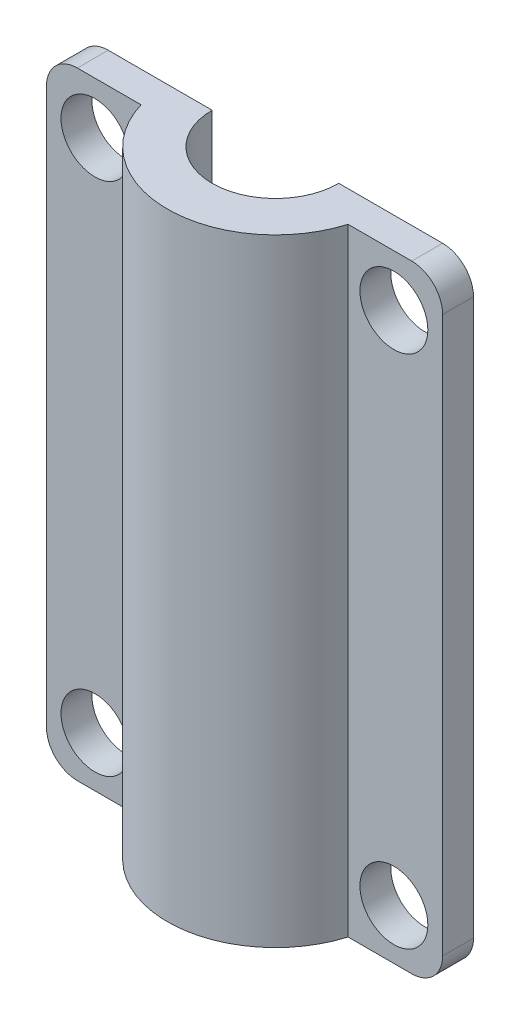
ISO-10303-21;
HEADER;
FILE_DESCRIPTION(('STEP AP214'),'2;1');
FILE_NAME('part.step','',(''),(''),'','','');
FILE_SCHEMA(('AUTOMOTIVE_DESIGN { 1 0 10303 214 1 1 1 1 }'));
ENDSEC;
DATA;
#1=APPLICATION_CONTEXT('core data for automotive mechanical design processes');
#2=APPLICATION_PROTOCOL_DEFINITION('international standard','automotive_design',2000,#1);
#3=PRODUCT_CONTEXT('',#1,'mechanical');
#4=PRODUCT('Part','Part','',(#3));
#5=PRODUCT_RELATED_PRODUCT_CATEGORY('part','',(#4));
#6=PRODUCT_DEFINITION_FORMATION('','',#4);
#7=PRODUCT_DEFINITION_CONTEXT('part definition',#1,'design');
#8=PRODUCT_DEFINITION('design','',#6,#7);
#9=PRODUCT_DEFINITION_SHAPE('','',#8);
#10=(LENGTH_UNIT() NAMED_UNIT(*) SI_UNIT(.MILLI.,.METRE.));
#11=(NAMED_UNIT(*) PLANE_ANGLE_UNIT() SI_UNIT($,.RADIAN.));
#12=(NAMED_UNIT(*) SI_UNIT($,.STERADIAN.) SOLID_ANGLE_UNIT());
#13=UNCERTAINTY_MEASURE_WITH_UNIT(LENGTH_MEASURE(1.E-05),#10,'distance_accuracy_value','');
#14=(GEOMETRIC_REPRESENTATION_CONTEXT(3) GLOBAL_UNCERTAINTY_ASSIGNED_CONTEXT((#13)) GLOBAL_UNIT_ASSIGNED_CONTEXT((#10,
#11,#12)) REPRESENTATION_CONTEXT('',''));
#15=CARTESIAN_POINT('',(0.,0.,0.));
#16=DIRECTION('',(0.,0.,1.));
#17=DIRECTION('',(1.,0.,0.));
#18=AXIS2_PLACEMENT_3D('',#15,#16,#17);
#19=CARTESIAN_POINT('',(67.3512185674811,20.,15.2871800490329));
#20=DIRECTION('',(0.,0.,-1.));
#21=DIRECTION('',(-1.,0.,0.));
#22=AXIS2_PLACEMENT_3D('',#19,#20,#21);
#23=PLANE('',#22);
#24=CARTESIAN_POINT('',(68.9210191731618,1.62968956518976,15.2871800490329));
#25=DIRECTION('',(0.,0.,-1.));
#26=DIRECTION('',(-1.,0.,0.));
#27=AXIS2_PLACEMENT_3D('',#24,#25,#26);
#28=CIRCLE('',#27,1.10000000000001);
#29=CARTESIAN_POINT('',(67.8210191731618,1.62968956518976,15.2871800490329));
#30=VERTEX_POINT('',#29);
#31=EDGE_CURVE('E245',#30,#30,#28,.T.);
#32=ORIENTED_EDGE('',*,*,#31,.T.);
#33=EDGE_LOOP('',(#32));
#34=FACE_BOUND('',#33,.T.);
#35=CARTESIAN_POINT('',(68.9210191731618,18.3272957416921,15.2871800490329));
#36=DIRECTION('',(0.,0.,-1.));
#37=DIRECTION('',(-1.,0.,0.));
#38=AXIS2_PLACEMENT_3D('',#35,#36,#37);
#39=CIRCLE('',#38,1.10000000000001);
#40=CARTESIAN_POINT('',(67.8210191731618,18.3272957416921,15.2871800490329));
#41=VERTEX_POINT('',#40);
#42=EDGE_CURVE('E248',#41,#41,#39,.T.);
#43=ORIENTED_EDGE('',*,*,#42,.T.);
#44=EDGE_LOOP('',(#43));
#45=FACE_BOUND('',#44,.T.);
#46=DIRECTION('',(1.,0.,0.));
#47=VECTOR('',#46,1.);
#48=CARTESIAN_POINT('',(67.3512185674811,20.,15.2871800490329));
#49=LINE('',#48,#47);
#50=CARTESIAN_POINT('',(68.3512185674811,20.,15.2871800490329));
#51=VERTEX_POINT('',#50);
#52=CARTESIAN_POINT('',(70.4146991460521,20.,15.2871800490329));
#53=VERTEX_POINT('',#52);
#54=EDGE_CURVE('E122',#51,#53,#49,.T.);
#55=ORIENTED_EDGE('',*,*,#54,.F.);
#56=CARTESIAN_POINT('',(68.3512185674811,19.,15.2871800490329));
#57=DIRECTION('',(0.,0.,-1.));
#58=DIRECTION('',(-1.,0.,0.));
#59=AXIS2_PLACEMENT_3D('',#56,#57,#58);
#60=CIRCLE('',#59,1.);
#61=CARTESIAN_POINT('',(67.3512185674811,19.,15.2871800490329));
#62=VERTEX_POINT('',#61);
#63=EDGE_CURVE('E175',#51,#62,#60,.F.);
#64=ORIENTED_EDGE('',*,*,#63,.T.);
#65=DIRECTION('',(0.,-1.,0.));
#66=VECTOR('',#65,1.);
#67=CARTESIAN_POINT('',(67.3512185674811,20.,15.2871800490329));
#68=LINE('',#67,#66);
#69=CARTESIAN_POINT('',(67.3512185674811,1.,15.2871800490329));
#70=VERTEX_POINT('',#69);
#71=EDGE_CURVE('E183',#62,#70,#68,.T.);
#72=ORIENTED_EDGE('',*,*,#71,.T.);
#73=CARTESIAN_POINT('',(68.3512185674811,1.,15.2871800490329));
#74=DIRECTION('',(0.,0.,-1.));
#75=DIRECTION('',(-1.,0.,0.));
#76=AXIS2_PLACEMENT_3D('',#73,#74,#75);
#77=CIRCLE('',#76,1.);
#78=CARTESIAN_POINT('',(68.3512185674811,0.,15.2871800490329));
#79=VERTEX_POINT('',#78);
#80=EDGE_CURVE('E173',#70,#79,#77,.F.);
#81=ORIENTED_EDGE('',*,*,#80,.T.);
#82=DIRECTION('',(1.,0.,0.));
#83=VECTOR('',#82,1.);
#84=CARTESIAN_POINT('',(67.3512185674811,0.,15.2871800490329));
#85=LINE('',#84,#83);
#86=CARTESIAN_POINT('',(70.4146991460521,0.,15.2871800490329));
#87=VERTEX_POINT('',#86);
#88=EDGE_CURVE('E145',#79,#87,#85,.T.);
#89=ORIENTED_EDGE('',*,*,#88,.T.);
#90=DIRECTION('',(0.,-1.,0.));
#91=VECTOR('',#90,1.);
#92=CARTESIAN_POINT('',(70.4146991460521,20.,15.2871800490329));
#93=LINE('',#92,#91);
#94=EDGE_CURVE('E138',#53,#87,#93,.T.);
#95=ORIENTED_EDGE('',*,*,#94,.F.);
#96=EDGE_LOOP('',(#55,#64,#72,#81,#89,#95));
#97=FACE_BOUND('',#96,.T.);
#98=ADVANCED_FACE('F33',(#34,#45,#97),#23,.F.);
#99=CARTESIAN_POINT('',(73.7688011123018,20.,14.2871800490328));
#100=DIRECTION('',(0.,-1.,0.));
#101=DIRECTION('',(0.,0.,-1.));
#102=AXIS2_PLACEMENT_3D('',#99,#100,#101);
#103=CYLINDRICAL_SURFACE('',#102,3.50000000000001);
#104=CARTESIAN_POINT('',(73.7688011123018,0.,14.2871800490328));
#105=DIRECTION('',(0.,1.,0.));
#106=DIRECTION('',(0.,0.,1.));
#107=AXIS2_PLACEMENT_3D('',#104,#105,#106);
#108=CIRCLE('',#107,3.50000000000001);
#109=CARTESIAN_POINT('',(77.1229030785515,0.,15.2871800490329));
#110=VERTEX_POINT('',#109);
#111=EDGE_CURVE('E230',#87,#110,#108,.T.);
#112=ORIENTED_EDGE('',*,*,#111,.T.);
#113=DIRECTION('',(0.,-1.,0.));
#114=VECTOR('',#113,1.);
#115=CARTESIAN_POINT('',(77.1229030785515,20.,15.2871800490329));
#116=LINE('',#115,#114);
#117=CARTESIAN_POINT('',(77.1229030785515,20.,15.2871800490329));
#118=VERTEX_POINT('',#117);
#119=EDGE_CURVE('E140',#118,#110,#116,.T.);
#120=ORIENTED_EDGE('',*,*,#119,.F.);
#121=CARTESIAN_POINT('',(73.7688011123018,20.,14.2871800490328));
#122=DIRECTION('',(0.,1.,0.));
#123=DIRECTION('',(0.,0.,1.));
#124=AXIS2_PLACEMENT_3D('',#121,#122,#123);
#125=CIRCLE('',#124,3.50000000000001);
#126=EDGE_CURVE('E126',#53,#118,#125,.T.);
#127=ORIENTED_EDGE('',*,*,#126,.F.);
#128=ORIENTED_EDGE('',*,*,#94,.T.);
#129=EDGE_LOOP('',(#112,#120,#127,#128));
#130=FACE_BOUND('',#129,.T.);
#131=ADVANCED_FACE('F137',(#130),#103,.T.);
#132=CARTESIAN_POINT('',(77.1229030785515,20.,15.2871800490329));
#133=DIRECTION('',(0.,0.,-1.));
#134=DIRECTION('',(-1.,0.,0.));
#135=AXIS2_PLACEMENT_3D('',#132,#133,#134);
#136=PLANE('',#135);
#137=CARTESIAN_POINT('',(78.6065542598319,18.3272957416921,15.2871800490329));
#138=DIRECTION('',(0.,0.,-1.));
#139=DIRECTION('',(-1.,0.,0.));
#140=AXIS2_PLACEMENT_3D('',#137,#138,#139);
#141=CIRCLE('',#140,1.10000000000001);
#142=CARTESIAN_POINT('',(77.5065542598319,18.3272957416921,15.2871800490329));
#143=VERTEX_POINT('',#142);
#144=EDGE_CURVE('E234',#143,#143,#141,.T.);
#145=ORIENTED_EDGE('',*,*,#144,.T.);
#146=EDGE_LOOP('',(#145));
#147=FACE_BOUND('',#146,.T.);
#148=CARTESIAN_POINT('',(78.6065542598319,1.62968956518976,15.2871800490329));
#149=DIRECTION('',(0.,0.,-1.));
#150=DIRECTION('',(-1.,0.,0.));
#151=AXIS2_PLACEMENT_3D('',#148,#149,#150);
#152=CIRCLE('',#151,1.10000000000001);
#153=CARTESIAN_POINT('',(77.5065542598319,1.62968956518976,15.2871800490329));
#154=VERTEX_POINT('',#153);
#155=EDGE_CURVE('E242',#154,#154,#152,.T.);
#156=ORIENTED_EDGE('',*,*,#155,.T.);
#157=EDGE_LOOP('',(#156));
#158=FACE_BOUND('',#157,.T.);
#159=DIRECTION('',(0.,-1.,0.));
#160=VECTOR('',#159,1.);
#161=CARTESIAN_POINT('',(80.1863836571224,20.,15.2871800490329));
#162=LINE('',#161,#160);
#163=CARTESIAN_POINT('',(80.1863836571224,19.,15.2871800490329));
#164=VERTEX_POINT('',#163);
#165=CARTESIAN_POINT('',(80.1863836571224,1.,15.2871800490329));
#166=VERTEX_POINT('',#165);
#167=EDGE_CURVE('E150',#164,#166,#162,.T.);
#168=ORIENTED_EDGE('',*,*,#167,.F.);
#169=CARTESIAN_POINT('',(79.1863836571224,19.,15.2871800490329));
#170=DIRECTION('',(0.,0.,-1.));
#171=DIRECTION('',(-1.,0.,0.));
#172=AXIS2_PLACEMENT_3D('',#169,#170,#171);
#173=CIRCLE('',#172,1.);
#174=CARTESIAN_POINT('',(79.1863836571224,20.,15.2871800490329));
#175=VERTEX_POINT('',#174);
#176=EDGE_CURVE('E167',#164,#175,#173,.F.);
#177=ORIENTED_EDGE('',*,*,#176,.T.);
#178=DIRECTION('',(1.,0.,0.));
#179=VECTOR('',#178,1.);
#180=CARTESIAN_POINT('',(77.1229030785515,20.,15.2871800490329));
#181=LINE('',#180,#179);
#182=EDGE_CURVE('E142',#118,#175,#181,.T.);
#183=ORIENTED_EDGE('',*,*,#182,.F.);
#184=ORIENTED_EDGE('',*,*,#119,.T.);
#185=DIRECTION('',(1.,0.,0.));
#186=VECTOR('',#185,1.);
#187=CARTESIAN_POINT('',(77.1229030785515,0.,15.2871800490329));
#188=LINE('',#187,#186);
#189=CARTESIAN_POINT('',(79.1863836571224,0.,15.2871800490329));
#190=VERTEX_POINT('',#189);
#191=EDGE_CURVE('E228',#110,#190,#188,.T.);
#192=ORIENTED_EDGE('',*,*,#191,.T.);
#193=CARTESIAN_POINT('',(79.1863836571224,1.,15.2871800490329));
#194=DIRECTION('',(0.,0.,-1.));
#195=DIRECTION('',(-1.,0.,0.));
#196=AXIS2_PLACEMENT_3D('',#193,#194,#195);
#197=CIRCLE('',#196,1.);
#198=EDGE_CURVE('E165',#190,#166,#197,.F.);
#199=ORIENTED_EDGE('',*,*,#198,.T.);
#200=EDGE_LOOP('',(#168,#177,#183,#184,#192,#199));
#201=FACE_BOUND('',#200,.T.);
#202=ADVANCED_FACE('F273',(#147,#158,#201),#136,.F.);
#203=CARTESIAN_POINT('',(80.1863836571224,20.,15.2871800490329));
#204=DIRECTION('',(-1.,0.,0.));
#205=DIRECTION('',(0.,0.,1.));
#206=AXIS2_PLACEMENT_3D('',#203,#204,#205);
#207=PLANE('',#206);
#208=DIRECTION('',(0.,-1.,0.));
#209=VECTOR('',#208,1.);
#210=CARTESIAN_POINT('',(80.1863836571224,20.,14.2871800490328));
#211=LINE('',#210,#209);
#212=CARTESIAN_POINT('',(80.1863836571224,19.,14.2871800490328));
#213=VERTEX_POINT('',#212);
#214=CARTESIAN_POINT('',(80.1863836571224,1.,14.2871800490328));
#215=VERTEX_POINT('',#214);
#216=EDGE_CURVE('E200',#213,#215,#211,.T.);
#217=ORIENTED_EDGE('',*,*,#216,.F.);
#218=DIRECTION('',(0.,0.,-1.));
#219=VECTOR('',#218,1.);
#220=CARTESIAN_POINT('',(80.1863836571224,19.,15.2871800490329));
#221=LINE('',#220,#219);
#222=EDGE_CURVE('E163',#213,#164,#221,.F.);
#223=ORIENTED_EDGE('',*,*,#222,.T.);
#224=ORIENTED_EDGE('',*,*,#167,.T.);
#225=DIRECTION('',(0.,0.,-1.));
#226=VECTOR('',#225,1.);
#227=CARTESIAN_POINT('',(80.1863836571224,1.,15.2871800490329));
#228=LINE('',#227,#226);
#229=EDGE_CURVE('E160',#166,#215,#228,.T.);
#230=ORIENTED_EDGE('',*,*,#229,.T.);
#231=EDGE_LOOP('',(#217,#223,#224,#230));
#232=FACE_BOUND('',#231,.T.);
#233=ADVANCED_FACE('F207',(#232),#207,.F.);
#234=CARTESIAN_POINT('',(80.1863836571224,20.,14.2871800490328));
#235=DIRECTION('',(0.,0.,1.));
#236=DIRECTION('',(1.,0.,0.));
#237=AXIS2_PLACEMENT_3D('',#234,#235,#236);
#238=PLANE('',#237);
#239=CARTESIAN_POINT('',(78.6065542598319,18.3272957416921,14.2871800490328));
#240=DIRECTION('',(0.,0.,1.));
#241=DIRECTION('',(1.,0.,0.));
#242=AXIS2_PLACEMENT_3D('',#239,#240,#241);
#243=CIRCLE('',#242,1.10000000000001);
#244=CARTESIAN_POINT('',(79.7065542598319,18.3272957416921,14.2871800490328));
#245=VERTEX_POINT('',#244);
#246=EDGE_CURVE('E255',#245,#245,#243,.T.);
#247=ORIENTED_EDGE('',*,*,#246,.T.);
#248=EDGE_LOOP('',(#247));
#249=FACE_BOUND('',#248,.T.);
#250=CARTESIAN_POINT('',(78.6065542598319,1.62968956518976,14.2871800490328));
#251=DIRECTION('',(0.,0.,1.));
#252=DIRECTION('',(1.,0.,0.));
#253=AXIS2_PLACEMENT_3D('',#250,#251,#252);
#254=CIRCLE('',#253,1.10000000000001);
#255=CARTESIAN_POINT('',(79.7065542598319,1.62968956518976,14.2871800490328));
#256=VERTEX_POINT('',#255);
#257=EDGE_CURVE('E258',#256,#256,#254,.T.);
#258=ORIENTED_EDGE('',*,*,#257,.T.);
#259=EDGE_LOOP('',(#258));
#260=FACE_BOUND('',#259,.T.);
#261=DIRECTION('',(-1.,0.,0.));
#262=VECTOR('',#261,1.);
#263=CARTESIAN_POINT('',(80.1863836571224,20.,14.2871800490328));
#264=LINE('',#263,#262);
#265=CARTESIAN_POINT('',(79.1863836571224,20.,14.2871800490328));
#266=VERTEX_POINT('',#265);
#267=CARTESIAN_POINT('',(75.8238850180164,20.,14.2871800490328));
#268=VERTEX_POINT('',#267);
#269=EDGE_CURVE('E237',#266,#268,#264,.T.);
#270=ORIENTED_EDGE('',*,*,#269,.F.);
#271=CARTESIAN_POINT('',(79.1863836571224,19.,14.2871800490328));
#272=DIRECTION('',(0.,0.,1.));
#273=DIRECTION('',(1.,0.,0.));
#274=AXIS2_PLACEMENT_3D('',#271,#272,#273);
#275=CIRCLE('',#274,1.);
#276=EDGE_CURVE('E158',#266,#213,#275,.F.);
#277=ORIENTED_EDGE('',*,*,#276,.T.);
#278=ORIENTED_EDGE('',*,*,#216,.T.);
#279=CARTESIAN_POINT('',(79.1863836571224,1.,14.2871800490328));
#280=DIRECTION('',(0.,0.,1.));
#281=DIRECTION('',(1.,0.,0.));
#282=AXIS2_PLACEMENT_3D('',#279,#280,#281);
#283=CIRCLE('',#282,1.);
#284=CARTESIAN_POINT('',(79.1863836571224,0.,14.2871800490328));
#285=VERTEX_POINT('',#284);
#286=EDGE_CURVE('E156',#215,#285,#283,.F.);
#287=ORIENTED_EDGE('',*,*,#286,.T.);
#288=DIRECTION('',(-1.,0.,0.));
#289=VECTOR('',#288,1.);
#290=CARTESIAN_POINT('',(80.1863836571224,0.,14.2871800490328));
#291=LINE('',#290,#289);
#292=CARTESIAN_POINT('',(75.8238850180164,0.,14.2871800490328));
#293=VERTEX_POINT('',#292);
#294=EDGE_CURVE('E220',#285,#293,#291,.T.);
#295=ORIENTED_EDGE('',*,*,#294,.T.);
#296=DIRECTION('',(0.,-1.,0.));
#297=VECTOR('',#296,1.);
#298=CARTESIAN_POINT('',(75.8238850180164,20.,14.2871800490328));
#299=LINE('',#298,#297);
#300=EDGE_CURVE('E197',#268,#293,#299,.T.);
#301=ORIENTED_EDGE('',*,*,#300,.F.);
#302=EDGE_LOOP('',(#270,#277,#278,#287,#295,#301));
#303=FACE_BOUND('',#302,.T.);
#304=ADVANCED_FACE('F218',(#249,#260,#303),#238,.F.);
#305=CARTESIAN_POINT('',(73.7713430651591,20.,14.2871800490329));
#306=DIRECTION('',(0.,-1.,0.));
#307=DIRECTION('',(0.,0.,-1.));
#308=AXIS2_PLACEMENT_3D('',#305,#306,#307);
#309=CYLINDRICAL_SURFACE('',#308,2.05254195285727);
#310=CARTESIAN_POINT('',(73.7713430651591,0.,14.2871800490329));
#311=DIRECTION('',(0.,-1.,0.));
#312=DIRECTION('',(0.,0.,1.));
#313=AXIS2_PLACEMENT_3D('',#310,#311,#312);
#314=CIRCLE('',#313,2.05254195285727);
#315=CARTESIAN_POINT('',(71.7188011123018,0.,14.2871800490329));
#316=VERTEX_POINT('',#315);
#317=EDGE_CURVE('E227',#293,#316,#314,.T.);
#318=ORIENTED_EDGE('',*,*,#317,.T.);
#319=DIRECTION('',(0.,-1.,0.));
#320=VECTOR('',#319,1.);
#321=CARTESIAN_POINT('',(71.7188011123018,20.,14.2871800490329));
#322=LINE('',#321,#320);
#323=CARTESIAN_POINT('',(71.7188011123018,20.,14.2871800490329));
#324=VERTEX_POINT('',#323);
#325=EDGE_CURVE('E188',#324,#316,#322,.T.);
#326=ORIENTED_EDGE('',*,*,#325,.F.);
#327=CARTESIAN_POINT('',(73.7713430651591,20.,14.2871800490329));
#328=DIRECTION('',(0.,-1.,0.));
#329=DIRECTION('',(0.,0.,1.));
#330=AXIS2_PLACEMENT_3D('',#327,#328,#329);
#331=CIRCLE('',#330,2.05254195285727);
#332=EDGE_CURVE('E190',#268,#324,#331,.T.);
#333=ORIENTED_EDGE('',*,*,#332,.F.);
#334=ORIENTED_EDGE('',*,*,#300,.T.);
#335=EDGE_LOOP('',(#318,#326,#333,#334));
#336=FACE_BOUND('',#335,.T.);
#337=ADVANCED_FACE('F307',(#336),#309,.F.);
#338=CARTESIAN_POINT('',(71.7188011123018,20.,14.2871800490329));
#339=DIRECTION('',(0.,0.,1.));
#340=DIRECTION('',(1.,0.,0.));
#341=AXIS2_PLACEMENT_3D('',#338,#339,#340);
#342=PLANE('',#341);
#343=CARTESIAN_POINT('',(68.9210191731618,1.62968956518976,14.2871800490328));
#344=DIRECTION('',(0.,0.,1.));
#345=DIRECTION('',(1.,0.,0.));
#346=AXIS2_PLACEMENT_3D('',#343,#344,#345);
#347=CIRCLE('',#346,1.10000000000001);
#348=CARTESIAN_POINT('',(70.0210191731618,1.62968956518976,14.2871800490328));
#349=VERTEX_POINT('',#348);
#350=EDGE_CURVE('E254',#349,#349,#347,.T.);
#351=ORIENTED_EDGE('',*,*,#350,.T.);
#352=EDGE_LOOP('',(#351));
#353=FACE_BOUND('',#352,.T.);
#354=CARTESIAN_POINT('',(68.9210191731618,18.3272957416921,14.2871800490328));
#355=DIRECTION('',(0.,0.,1.));
#356=DIRECTION('',(1.,0.,0.));
#357=AXIS2_PLACEMENT_3D('',#354,#355,#356);
#358=CIRCLE('',#357,1.10000000000001);
#359=CARTESIAN_POINT('',(70.0210191731618,18.3272957416921,14.2871800490328));
#360=VERTEX_POINT('',#359);
#361=EDGE_CURVE('E251',#360,#360,#358,.T.);
#362=ORIENTED_EDGE('',*,*,#361,.T.);
#363=EDGE_LOOP('',(#362));
#364=FACE_BOUND('',#363,.T.);
#365=DIRECTION('',(0.,-1.,0.));
#366=VECTOR('',#365,1.);
#367=CARTESIAN_POINT('',(67.3512185674811,20.,14.2871800490329));
#368=LINE('',#367,#366);
#369=CARTESIAN_POINT('',(67.3512185674811,19.,14.2871800490329));
#370=VERTEX_POINT('',#369);
#371=CARTESIAN_POINT('',(67.3512185674811,1.,14.2871800490329));
#372=VERTEX_POINT('',#371);
#373=EDGE_CURVE('E184',#370,#372,#368,.T.);
#374=ORIENTED_EDGE('',*,*,#373,.F.);
#375=CARTESIAN_POINT('',(68.3512185674811,19.,14.2871800490329));
#376=DIRECTION('',(0.,0.,1.));
#377=DIRECTION('',(1.,0.,0.));
#378=AXIS2_PLACEMENT_3D('',#375,#376,#377);
#379=CIRCLE('',#378,1.);
#380=CARTESIAN_POINT('',(68.3512185674811,20.,14.2871800490329));
#381=VERTEX_POINT('',#380);
#382=EDGE_CURVE('E11',#370,#381,#379,.F.);
#383=ORIENTED_EDGE('',*,*,#382,.T.);
#384=DIRECTION('',(-1.,0.,0.));
#385=VECTOR('',#384,1.);
#386=CARTESIAN_POINT('',(71.7188011123018,20.,14.2871800490329));
#387=LINE('',#386,#385);
#388=EDGE_CURVE('E186',#324,#381,#387,.T.);
#389=ORIENTED_EDGE('',*,*,#388,.F.);
#390=ORIENTED_EDGE('',*,*,#325,.T.);
#391=DIRECTION('',(-1.,0.,0.));
#392=VECTOR('',#391,1.);
#393=CARTESIAN_POINT('',(71.7188011123018,0.,14.2871800490329));
#394=LINE('',#393,#392);
#395=CARTESIAN_POINT('',(68.3512185674811,0.,14.2871800490329));
#396=VERTEX_POINT('',#395);
#397=EDGE_CURVE('E133',#316,#396,#394,.T.);
#398=ORIENTED_EDGE('',*,*,#397,.T.);
#399=CARTESIAN_POINT('',(68.3512185674811,1.,14.2871800490329));
#400=DIRECTION('',(0.,0.,1.));
#401=DIRECTION('',(1.,0.,0.));
#402=AXIS2_PLACEMENT_3D('',#399,#400,#401);
#403=CIRCLE('',#402,1.);
#404=EDGE_CURVE('E41',#396,#372,#403,.F.);
#405=ORIENTED_EDGE('',*,*,#404,.T.);
#406=EDGE_LOOP('',(#374,#383,#389,#390,#398,#405));
#407=FACE_BOUND('',#406,.T.);
#408=ADVANCED_FACE('F303',(#353,#364,#407),#342,.F.);
#409=CARTESIAN_POINT('',(67.3512185674811,20.,14.2871800490329));
#410=DIRECTION('',(1.,0.,0.));
#411=DIRECTION('',(0.,0.,-1.));
#412=AXIS2_PLACEMENT_3D('',#409,#410,#411);
#413=PLANE('',#412);
#414=ORIENTED_EDGE('',*,*,#71,.F.);
#415=DIRECTION('',(0.,0.,1.));
#416=VECTOR('',#415,1.);
#417=CARTESIAN_POINT('',(67.3512185674811,19.,14.2871800490329));
#418=LINE('',#417,#416);
#419=EDGE_CURVE('E54',#62,#370,#418,.F.);
#420=ORIENTED_EDGE('',*,*,#419,.T.);
#421=ORIENTED_EDGE('',*,*,#373,.T.);
#422=DIRECTION('',(0.,0.,1.));
#423=VECTOR('',#422,1.);
#424=CARTESIAN_POINT('',(67.3512185674811,1.,14.2871800490329));
#425=LINE('',#424,#423);
#426=EDGE_CURVE('E177',#372,#70,#425,.T.);
#427=ORIENTED_EDGE('',*,*,#426,.T.);
#428=EDGE_LOOP('',(#414,#420,#421,#427));
#429=FACE_BOUND('',#428,.T.);
#430=ADVANCED_FACE('F182',(#429),#413,.F.);
#431=CARTESIAN_POINT('',(73.7688011123018,20.,14.2871800490328));
#432=DIRECTION('',(0.,1.,0.));
#433=DIRECTION('',(0.,0.,1.));
#434=AXIS2_PLACEMENT_3D('',#431,#432,#433);
#435=PLANE('',#434);
#436=ORIENTED_EDGE('',*,*,#182,.T.);
#437=DIRECTION('',(0.,0.,-1.));
#438=VECTOR('',#437,1.);
#439=CARTESIAN_POINT('',(79.1863836571224,20.,14.2871800490328));
#440=LINE('',#439,#438);
#441=EDGE_CURVE('E148',#175,#266,#440,.T.);
#442=ORIENTED_EDGE('',*,*,#441,.T.);
#443=ORIENTED_EDGE('',*,*,#269,.T.);
#444=ORIENTED_EDGE('',*,*,#332,.T.);
#445=ORIENTED_EDGE('',*,*,#388,.T.);
#446=DIRECTION('',(0.,0.,1.));
#447=VECTOR('',#446,1.);
#448=CARTESIAN_POINT('',(68.3512185674811,20.,15.2871800490329));
#449=LINE('',#448,#447);
#450=EDGE_CURVE('E130',#381,#51,#449,.T.);
#451=ORIENTED_EDGE('',*,*,#450,.T.);
#452=ORIENTED_EDGE('',*,*,#54,.T.);
#453=ORIENTED_EDGE('',*,*,#126,.T.);
#454=EDGE_LOOP('',(#436,#442,#443,#444,#445,#451,#452,#453));
#455=FACE_BOUND('',#454,.T.);
#456=ADVANCED_FACE('F125',(#455),#435,.T.);
#457=CARTESIAN_POINT('',(73.7688011123018,0.,14.2871800490328));
#458=DIRECTION('',(0.,1.,0.));
#459=DIRECTION('',(0.,0.,1.));
#460=AXIS2_PLACEMENT_3D('',#457,#458,#459);
#461=PLANE('',#460);
#462=ORIENTED_EDGE('',*,*,#294,.F.);
#463=DIRECTION('',(0.,0.,-1.));
#464=VECTOR('',#463,1.);
#465=CARTESIAN_POINT('',(79.1863836571224,0.,14.2871800490328));
#466=LINE('',#465,#464);
#467=EDGE_CURVE('E171',#285,#190,#466,.F.);
#468=ORIENTED_EDGE('',*,*,#467,.T.);
#469=ORIENTED_EDGE('',*,*,#191,.F.);
#470=ORIENTED_EDGE('',*,*,#111,.F.);
#471=ORIENTED_EDGE('',*,*,#88,.F.);
#472=DIRECTION('',(0.,0.,1.));
#473=VECTOR('',#472,1.);
#474=CARTESIAN_POINT('',(68.3512185674811,0.,14.2871800490328));
#475=LINE('',#474,#473);
#476=EDGE_CURVE('E169',#79,#396,#475,.F.);
#477=ORIENTED_EDGE('',*,*,#476,.T.);
#478=ORIENTED_EDGE('',*,*,#397,.F.);
#479=ORIENTED_EDGE('',*,*,#317,.F.);
#480=EDGE_LOOP('',(#462,#468,#469,#470,#471,#477,#478,#479));
#481=FACE_BOUND('',#480,.T.);
#482=ADVANCED_FACE('F223',(#481),#461,.F.);
#483=CARTESIAN_POINT('',(68.9210191731618,18.3272957416921,14.2871800490328));
#484=DIRECTION('',(0.,0.,1.));
#485=DIRECTION('',(1.,0.,0.));
#486=AXIS2_PLACEMENT_3D('',#483,#484,#485);
#487=CYLINDRICAL_SURFACE('',#486,1.10000000000001);
#488=ORIENTED_EDGE('',*,*,#361,.F.);
#489=EDGE_LOOP('',(#488));
#490=FACE_BOUND('',#489,.T.);
#491=ORIENTED_EDGE('',*,*,#42,.F.);
#492=EDGE_LOOP('',(#491));
#493=FACE_BOUND('',#492,.T.);
#494=ADVANCED_FACE('F325',(#490,#493),#487,.F.);
#495=CARTESIAN_POINT('',(68.9210191731618,1.62968956518976,14.2871800490328));
#496=DIRECTION('',(0.,0.,1.));
#497=DIRECTION('',(1.,0.,0.));
#498=AXIS2_PLACEMENT_3D('',#495,#496,#497);
#499=CYLINDRICAL_SURFACE('',#498,1.10000000000001);
#500=ORIENTED_EDGE('',*,*,#350,.F.);
#501=EDGE_LOOP('',(#500));
#502=FACE_BOUND('',#501,.T.);
#503=ORIENTED_EDGE('',*,*,#31,.F.);
#504=EDGE_LOOP('',(#503));
#505=FACE_BOUND('',#504,.T.);
#506=ADVANCED_FACE('F269',(#502,#505),#499,.F.);
#507=CARTESIAN_POINT('',(78.6065542598319,1.62968956518976,14.2871800490328));
#508=DIRECTION('',(0.,0.,1.));
#509=DIRECTION('',(1.,0.,0.));
#510=AXIS2_PLACEMENT_3D('',#507,#508,#509);
#511=CYLINDRICAL_SURFACE('',#510,1.10000000000001);
#512=ORIENTED_EDGE('',*,*,#257,.F.);
#513=EDGE_LOOP('',(#512));
#514=FACE_BOUND('',#513,.T.);
#515=ORIENTED_EDGE('',*,*,#155,.F.);
#516=EDGE_LOOP('',(#515));
#517=FACE_BOUND('',#516,.T.);
#518=ADVANCED_FACE('F265',(#514,#517),#511,.F.);
#519=CARTESIAN_POINT('',(78.6065542598319,18.3272957416921,14.2871800490328));
#520=DIRECTION('',(0.,0.,1.));
#521=DIRECTION('',(1.,0.,0.));
#522=AXIS2_PLACEMENT_3D('',#519,#520,#521);
#523=CYLINDRICAL_SURFACE('',#522,1.10000000000001);
#524=ORIENTED_EDGE('',*,*,#246,.F.);
#525=EDGE_LOOP('',(#524));
#526=FACE_BOUND('',#525,.T.);
#527=ORIENTED_EDGE('',*,*,#144,.F.);
#528=EDGE_LOOP('',(#527));
#529=FACE_BOUND('',#528,.T.);
#530=ADVANCED_FACE('F268',(#526,#529),#523,.F.);
#531=CARTESIAN_POINT('',(79.1863836571224,19.,14.2871800490328));
#532=DIRECTION('',(0.,0.,1.));
#533=DIRECTION('',(1.,0.,0.));
#534=AXIS2_PLACEMENT_3D('',#531,#532,#533);
#535=CYLINDRICAL_SURFACE('',#534,1.);
#536=ORIENTED_EDGE('',*,*,#176,.F.);
#537=ORIENTED_EDGE('',*,*,#222,.F.);
#538=ORIENTED_EDGE('',*,*,#276,.F.);
#539=ORIENTED_EDGE('',*,*,#441,.F.);
#540=EDGE_LOOP('',(#536,#537,#538,#539));
#541=FACE_BOUND('',#540,.T.);
#542=ADVANCED_FACE('F290',(#541),#535,.T.);
#543=CARTESIAN_POINT('',(79.1863836571224,1.,15.2871800490329));
#544=DIRECTION('',(0.,0.,-1.));
#545=DIRECTION('',(-1.,0.,0.));
#546=AXIS2_PLACEMENT_3D('',#543,#544,#545);
#547=CYLINDRICAL_SURFACE('',#546,1.);
#548=ORIENTED_EDGE('',*,*,#198,.F.);
#549=ORIENTED_EDGE('',*,*,#467,.F.);
#550=ORIENTED_EDGE('',*,*,#286,.F.);
#551=ORIENTED_EDGE('',*,*,#229,.F.);
#552=EDGE_LOOP('',(#548,#549,#550,#551));
#553=FACE_BOUND('',#552,.T.);
#554=ADVANCED_FACE('F213',(#553),#547,.T.);
#555=CARTESIAN_POINT('',(68.3512185674811,19.,14.2871800490328));
#556=DIRECTION('',(0.,0.,-1.));
#557=DIRECTION('',(-1.,0.,0.));
#558=AXIS2_PLACEMENT_3D('',#555,#556,#557);
#559=CYLINDRICAL_SURFACE('',#558,1.);
#560=ORIENTED_EDGE('',*,*,#382,.F.);
#561=ORIENTED_EDGE('',*,*,#419,.F.);
#562=ORIENTED_EDGE('',*,*,#63,.F.);
#563=ORIENTED_EDGE('',*,*,#450,.F.);
#564=EDGE_LOOP('',(#560,#561,#562,#563));
#565=FACE_BOUND('',#564,.T.);
#566=ADVANCED_FACE('F295',(#565),#559,.T.);
#567=CARTESIAN_POINT('',(68.3512185674811,1.,14.2871800490329));
#568=DIRECTION('',(0.,0.,1.));
#569=DIRECTION('',(1.,0.,0.));
#570=AXIS2_PLACEMENT_3D('',#567,#568,#569);
#571=CYLINDRICAL_SURFACE('',#570,1.);
#572=ORIENTED_EDGE('',*,*,#404,.F.);
#573=ORIENTED_EDGE('',*,*,#476,.F.);
#574=ORIENTED_EDGE('',*,*,#80,.F.);
#575=ORIENTED_EDGE('',*,*,#426,.F.);
#576=EDGE_LOOP('',(#572,#573,#574,#575));
#577=FACE_BOUND('',#576,.T.);
#578=ADVANCED_FACE('F35',(#577),#571,.T.);
#579=CLOSED_SHELL('',(#98,#131,#202,#233,#304,#337,#408,#430,#456,#482,#494,#506,#518,#530,#542,
#554,#566,#578));
#580=MANIFOLD_SOLID_BREP('B2',#579);
#581=ADVANCED_BREP_SHAPE_REPRESENTATION('',(#18,#580),#14);
#582=SHAPE_DEFINITION_REPRESENTATION(#9,#581);
ENDSEC;
END-ISO-10303-21;
